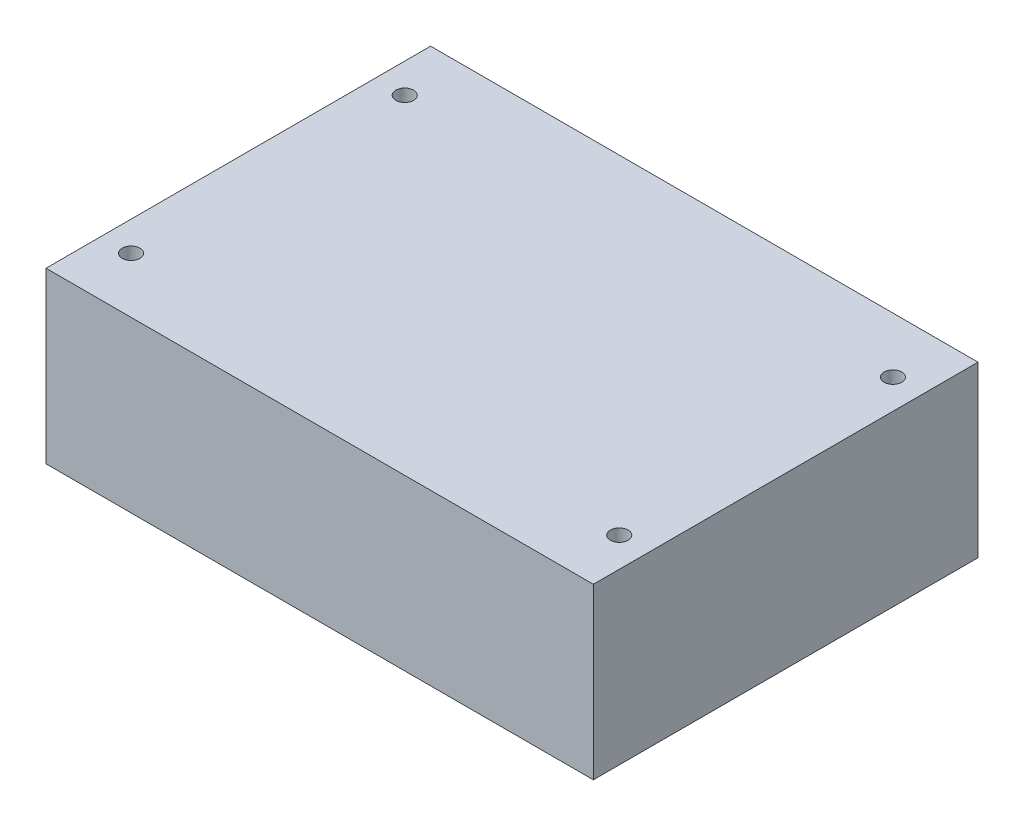
ISO-10303-21;
HEADER;
FILE_DESCRIPTION(('STEP AP214'),'2;1');
FILE_NAME('part.step','',(''),(''),'','','');
FILE_SCHEMA(('AUTOMOTIVE_DESIGN { 1 0 10303 214 1 1 1 1 }'));
ENDSEC;
DATA;
#1=APPLICATION_CONTEXT('core data for automotive mechanical design processes');
#2=APPLICATION_PROTOCOL_DEFINITION('international standard','automotive_design',2000,#1);
#3=PRODUCT_CONTEXT('',#1,'mechanical');
#4=PRODUCT('Part','Part','',(#3));
#5=PRODUCT_RELATED_PRODUCT_CATEGORY('part','',(#4));
#6=PRODUCT_DEFINITION_FORMATION('','',#4);
#7=PRODUCT_DEFINITION_CONTEXT('part definition',#1,'design');
#8=PRODUCT_DEFINITION('design','',#6,#7);
#9=PRODUCT_DEFINITION_SHAPE('','',#8);
#10=(LENGTH_UNIT() NAMED_UNIT(*) SI_UNIT(.MILLI.,.METRE.));
#11=(NAMED_UNIT(*) PLANE_ANGLE_UNIT() SI_UNIT($,.RADIAN.));
#12=(NAMED_UNIT(*) SI_UNIT($,.STERADIAN.) SOLID_ANGLE_UNIT());
#13=UNCERTAINTY_MEASURE_WITH_UNIT(LENGTH_MEASURE(1.E-05),#10,'distance_accuracy_value','');
#14=(GEOMETRIC_REPRESENTATION_CONTEXT(3) GLOBAL_UNCERTAINTY_ASSIGNED_CONTEXT((#13)) GLOBAL_UNIT_ASSIGNED_CONTEXT((#10,
#11,#12)) REPRESENTATION_CONTEXT('',''));
#15=CARTESIAN_POINT('',(0.,0.,0.));
#16=DIRECTION('',(0.,0.,1.));
#17=DIRECTION('',(1.,0.,0.));
#18=AXIS2_PLACEMENT_3D('',#15,#16,#17);
#19=CARTESIAN_POINT('',(63.98994351206,33.9,-99.5340959573736));
#20=DIRECTION('',(0.,0.,-1.));
#21=DIRECTION('',(-1.,0.,0.));
#22=AXIS2_PLACEMENT_3D('',#19,#20,#21);
#23=PLANE('',#22);
#24=DIRECTION('',(1.,0.,0.));
#25=VECTOR('',#24,1.);
#26=CARTESIAN_POINT('',(63.98994351206,11.,-99.5340959573736));
#27=LINE('',#26,#25);
#28=CARTESIAN_POINT('',(63.98994351206,11.,-99.5340959573736));
#29=VERTEX_POINT('',#28);
#30=CARTESIAN_POINT('',(137.98994351206,11.,-99.5340959573736));
#31=VERTEX_POINT('',#30);
#32=EDGE_CURVE('E122',#29,#31,#27,.T.);
#33=ORIENTED_EDGE('',*,*,#32,.F.);
#34=DIRECTION('',(0.,-1.,0.));
#35=VECTOR('',#34,1.);
#36=CARTESIAN_POINT('',(63.98994351206,33.9,-99.5340959573736));
#37=LINE('',#36,#35);
#38=CARTESIAN_POINT('',(63.98994351206,33.9,-99.5340959573736));
#39=VERTEX_POINT('',#38);
#40=EDGE_CURVE('E11',#39,#29,#37,.T.);
#41=ORIENTED_EDGE('',*,*,#40,.F.);
#42=DIRECTION('',(1.,0.,0.));
#43=VECTOR('',#42,1.);
#44=CARTESIAN_POINT('',(63.98994351206,33.9,-99.5340959573736));
#45=LINE('',#44,#43);
#46=CARTESIAN_POINT('',(137.98994351206,33.9,-99.5340959573736));
#47=VERTEX_POINT('',#46);
#48=EDGE_CURVE('E123',#39,#47,#45,.T.);
#49=ORIENTED_EDGE('',*,*,#48,.T.);
#50=DIRECTION('',(0.,-1.,0.));
#51=VECTOR('',#50,1.);
#52=CARTESIAN_POINT('',(137.98994351206,33.9,-99.5340959573736));
#53=LINE('',#52,#51);
#54=EDGE_CURVE('E35',#47,#31,#53,.T.);
#55=ORIENTED_EDGE('',*,*,#54,.T.);
#56=EDGE_LOOP('',(#33,#41,#49,#55));
#57=FACE_BOUND('',#56,.T.);
#58=ADVANCED_FACE('F32',(#57),#23,.T.);
#59=CARTESIAN_POINT('',(63.98994351206,33.9,-47.5340959573736));
#60=DIRECTION('',(-1.,0.,0.));
#61=DIRECTION('',(0.,0.,1.));
#62=AXIS2_PLACEMENT_3D('',#59,#60,#61);
#63=PLANE('',#62);
#64=DIRECTION('',(0.,0.,-1.));
#65=VECTOR('',#64,1.);
#66=CARTESIAN_POINT('',(63.98994351206,11.,-47.5340959573736));
#67=LINE('',#66,#65);
#68=CARTESIAN_POINT('',(63.98994351206,11.,-47.5340959573736));
#69=VERTEX_POINT('',#68);
#70=EDGE_CURVE('E125',#69,#29,#67,.T.);
#71=ORIENTED_EDGE('',*,*,#70,.F.);
#72=DIRECTION('',(0.,-1.,0.));
#73=VECTOR('',#72,1.);
#74=CARTESIAN_POINT('',(63.98994351206,33.9,-47.5340959573736));
#75=LINE('',#74,#73);
#76=CARTESIAN_POINT('',(63.98994351206,33.9,-47.5340959573736));
#77=VERTEX_POINT('',#76);
#78=EDGE_CURVE('E41',#77,#69,#75,.T.);
#79=ORIENTED_EDGE('',*,*,#78,.F.);
#80=DIRECTION('',(0.,0.,-1.));
#81=VECTOR('',#80,1.);
#82=CARTESIAN_POINT('',(63.98994351206,33.9,-47.5340959573736));
#83=LINE('',#82,#81);
#84=EDGE_CURVE('E129',#77,#39,#83,.T.);
#85=ORIENTED_EDGE('',*,*,#84,.T.);
#86=ORIENTED_EDGE('',*,*,#40,.T.);
#87=EDGE_LOOP('',(#71,#79,#85,#86));
#88=FACE_BOUND('',#87,.T.);
#89=ADVANCED_FACE('F148',(#88),#63,.T.);
#90=CARTESIAN_POINT('',(63.98994351206,33.9,-47.5340959573736));
#91=DIRECTION('',(0.,0.,-1.));
#92=DIRECTION('',(-1.,0.,0.));
#93=AXIS2_PLACEMENT_3D('',#90,#91,#92);
#94=PLANE('',#93);
#95=DIRECTION('',(1.,0.,0.));
#96=VECTOR('',#95,1.);
#97=CARTESIAN_POINT('',(63.98994351206,11.,-47.5340959573736));
#98=LINE('',#97,#96);
#99=CARTESIAN_POINT('',(137.98994351206,11.,-47.5340959573736));
#100=VERTEX_POINT('',#99);
#101=EDGE_CURVE('E136',#69,#100,#98,.T.);
#102=ORIENTED_EDGE('',*,*,#101,.T.);
#103=DIRECTION('',(0.,-1.,0.));
#104=VECTOR('',#103,1.);
#105=CARTESIAN_POINT('',(137.98994351206,33.9,-47.5340959573736));
#106=LINE('',#105,#104);
#107=CARTESIAN_POINT('',(137.98994351206,33.9,-47.5340959573736));
#108=VERTEX_POINT('',#107);
#109=EDGE_CURVE('E140',#108,#100,#106,.T.);
#110=ORIENTED_EDGE('',*,*,#109,.F.);
#111=DIRECTION('',(1.,0.,0.));
#112=VECTOR('',#111,1.);
#113=CARTESIAN_POINT('',(63.98994351206,33.9,-47.5340959573736));
#114=LINE('',#113,#112);
#115=EDGE_CURVE('E127',#77,#108,#114,.T.);
#116=ORIENTED_EDGE('',*,*,#115,.F.);
#117=ORIENTED_EDGE('',*,*,#78,.T.);
#118=EDGE_LOOP('',(#102,#110,#116,#117));
#119=FACE_BOUND('',#118,.T.);
#120=ADVANCED_FACE('F150',(#119),#94,.F.);
#121=CARTESIAN_POINT('',(137.98994351206,33.9,-47.5340959573736));
#122=DIRECTION('',(-1.,0.,0.));
#123=DIRECTION('',(0.,0.,1.));
#124=AXIS2_PLACEMENT_3D('',#121,#122,#123);
#125=PLANE('',#124);
#126=DIRECTION('',(0.,0.,-1.));
#127=VECTOR('',#126,1.);
#128=CARTESIAN_POINT('',(137.98994351206,11.,-47.5340959573736));
#129=LINE('',#128,#127);
#130=EDGE_CURVE('E133',#100,#31,#129,.T.);
#131=ORIENTED_EDGE('',*,*,#130,.T.);
#132=ORIENTED_EDGE('',*,*,#54,.F.);
#133=DIRECTION('',(0.,0.,-1.));
#134=VECTOR('',#133,1.);
#135=CARTESIAN_POINT('',(137.98994351206,33.9,-47.5340959573736));
#136=LINE('',#135,#134);
#137=EDGE_CURVE('E75',#108,#47,#136,.T.);
#138=ORIENTED_EDGE('',*,*,#137,.F.);
#139=ORIENTED_EDGE('',*,*,#109,.T.);
#140=EDGE_LOOP('',(#131,#132,#138,#139));
#141=FACE_BOUND('',#140,.T.);
#142=ADVANCED_FACE('F145',(#141),#125,.F.);
#143=CARTESIAN_POINT('',(0.,33.9,0.));
#144=DIRECTION('',(0.,1.,0.));
#145=DIRECTION('',(0.,0.,1.));
#146=AXIS2_PLACEMENT_3D('',#143,#144,#145);
#147=PLANE('',#146);
#148=CARTESIAN_POINT('',(67.98994351206,33.9,-92.0340959573736));
#149=DIRECTION('',(0.,1.,0.));
#150=DIRECTION('',(0.,0.,1.));
#151=AXIS2_PLACEMENT_3D('',#148,#149,#150);
#152=CIRCLE('',#151,1.20000000000001);
#153=CARTESIAN_POINT('',(67.98994351206,33.9,-90.8340959573736));
#154=VERTEX_POINT('',#153);
#155=EDGE_CURVE('E100',#154,#154,#152,.T.);
#156=ORIENTED_EDGE('',*,*,#155,.F.);
#157=EDGE_LOOP('',(#156));
#158=FACE_BOUND('',#157,.T.);
#159=CARTESIAN_POINT('',(133.98994351206,33.9,-92.0340959573736));
#160=DIRECTION('',(0.,1.,0.));
#161=DIRECTION('',(0.,0.,1.));
#162=AXIS2_PLACEMENT_3D('',#159,#160,#161);
#163=CIRCLE('',#162,1.20000000000001);
#164=CARTESIAN_POINT('',(133.98994351206,33.9,-90.8340959573736));
#165=VERTEX_POINT('',#164);
#166=EDGE_CURVE('E99',#165,#165,#163,.T.);
#167=ORIENTED_EDGE('',*,*,#166,.F.);
#168=EDGE_LOOP('',(#167));
#169=FACE_BOUND('',#168,.T.);
#170=CARTESIAN_POINT('',(133.98994351206,33.9,-55.0340959573736));
#171=DIRECTION('',(0.,1.,0.));
#172=DIRECTION('',(0.,0.,1.));
#173=AXIS2_PLACEMENT_3D('',#170,#171,#172);
#174=CIRCLE('',#173,1.20000000000001);
#175=CARTESIAN_POINT('',(133.98994351206,33.9,-53.8340959573736));
#176=VERTEX_POINT('',#175);
#177=EDGE_CURVE('E110',#176,#176,#174,.T.);
#178=ORIENTED_EDGE('',*,*,#177,.F.);
#179=EDGE_LOOP('',(#178));
#180=FACE_BOUND('',#179,.T.);
#181=CARTESIAN_POINT('',(67.98994351206,33.9,-55.0340959573736));
#182=DIRECTION('',(0.,1.,0.));
#183=DIRECTION('',(0.,0.,1.));
#184=AXIS2_PLACEMENT_3D('',#181,#182,#183);
#185=CIRCLE('',#184,1.20000000000001);
#186=CARTESIAN_POINT('',(67.98994351206,33.9,-53.8340959573736));
#187=VERTEX_POINT('',#186);
#188=EDGE_CURVE('E116',#187,#187,#185,.T.);
#189=ORIENTED_EDGE('',*,*,#188,.F.);
#190=EDGE_LOOP('',(#189));
#191=FACE_BOUND('',#190,.T.);
#192=ORIENTED_EDGE('',*,*,#48,.F.);
#193=ORIENTED_EDGE('',*,*,#84,.F.);
#194=ORIENTED_EDGE('',*,*,#115,.T.);
#195=ORIENTED_EDGE('',*,*,#137,.T.);
#196=EDGE_LOOP('',(#192,#193,#194,#195));
#197=FACE_BOUND('',#196,.T.);
#198=ADVANCED_FACE('F151',(#158,#169,#180,#191,#197),#147,.T.);
#199=CARTESIAN_POINT('',(0.,11.,0.));
#200=DIRECTION('',(0.,1.,0.));
#201=DIRECTION('',(0.,0.,1.));
#202=AXIS2_PLACEMENT_3D('',#199,#200,#201);
#203=PLANE('',#202);
#204=ORIENTED_EDGE('',*,*,#32,.T.);
#205=ORIENTED_EDGE('',*,*,#130,.F.);
#206=ORIENTED_EDGE('',*,*,#101,.F.);
#207=ORIENTED_EDGE('',*,*,#70,.T.);
#208=EDGE_LOOP('',(#204,#205,#206,#207));
#209=FACE_BOUND('',#208,.T.);
#210=ADVANCED_FACE('F147',(#209),#203,.F.);
#211=CARTESIAN_POINT('',(67.98994351206,31.4,-55.0340959573736));
#212=DIRECTION('',(0.,1.,0.));
#213=DIRECTION('',(0.,0.,1.));
#214=AXIS2_PLACEMENT_3D('',#211,#212,#213);
#215=CONICAL_SURFACE('',#214,1.19999999999999,1.02974425867665);
#216=CARTESIAN_POINT('',(67.98994351206,30.6789672571669,-55.0340959573736));
#217=VERTEX_POINT('',#216);
#218=VERTEX_LOOP('',#217);
#219=FACE_BOUND('',#218,.T.);
#220=CARTESIAN_POINT('',(67.98994351206,31.4,-55.0340959573736));
#221=DIRECTION('',(0.,1.,0.));
#222=DIRECTION('',(0.,0.,1.));
#223=AXIS2_PLACEMENT_3D('',#220,#221,#222);
#224=CIRCLE('',#223,1.19999999999999);
#225=CARTESIAN_POINT('',(67.98994351206,31.4,-53.8340959573736));
#226=VERTEX_POINT('',#225);
#227=EDGE_CURVE('E119',#226,#226,#224,.T.);
#228=ORIENTED_EDGE('',*,*,#227,.T.);
#229=EDGE_LOOP('',(#228));
#230=FACE_BOUND('',#229,.T.);
#231=ADVANCED_FACE('F159',(#219,#230),#215,.F.);
#232=CARTESIAN_POINT('',(67.98994351206,33.9,-55.0340959573736));
#233=DIRECTION('',(0.,1.,0.));
#234=DIRECTION('',(0.,0.,1.));
#235=AXIS2_PLACEMENT_3D('',#232,#233,#234);
#236=CYLINDRICAL_SURFACE('',#235,1.2);
#237=ORIENTED_EDGE('',*,*,#227,.F.);
#238=EDGE_LOOP('',(#237));
#239=FACE_BOUND('',#238,.T.);
#240=ORIENTED_EDGE('',*,*,#188,.T.);
#241=EDGE_LOOP('',(#240));
#242=FACE_BOUND('',#241,.T.);
#243=ADVANCED_FACE('F198',(#239,#242),#236,.F.);
#244=CARTESIAN_POINT('',(133.98994351206,31.4,-55.0340959573736));
#245=DIRECTION('',(0.,1.,0.));
#246=DIRECTION('',(0.,0.,1.));
#247=AXIS2_PLACEMENT_3D('',#244,#245,#246);
#248=CONICAL_SURFACE('',#247,1.20000000000001,1.02974425867666);
#249=CARTESIAN_POINT('',(133.98994351206,30.6789672571669,-55.0340959573736));
#250=VERTEX_POINT('',#249);
#251=VERTEX_LOOP('',#250);
#252=FACE_BOUND('',#251,.T.);
#253=CARTESIAN_POINT('',(133.98994351206,31.4,-55.0340959573736));
#254=DIRECTION('',(0.,1.,0.));
#255=DIRECTION('',(0.,0.,1.));
#256=AXIS2_PLACEMENT_3D('',#253,#254,#255);
#257=CIRCLE('',#256,1.20000000000001);
#258=CARTESIAN_POINT('',(133.98994351206,31.4,-53.8340959573736));
#259=VERTEX_POINT('',#258);
#260=EDGE_CURVE('E113',#259,#259,#257,.T.);
#261=ORIENTED_EDGE('',*,*,#260,.T.);
#262=EDGE_LOOP('',(#261));
#263=FACE_BOUND('',#262,.T.);
#264=ADVANCED_FACE('F207',(#252,#263),#248,.F.);
#265=CARTESIAN_POINT('',(133.98994351206,33.9,-55.0340959573736));
#266=DIRECTION('',(0.,1.,0.));
#267=DIRECTION('',(0.,0.,1.));
#268=AXIS2_PLACEMENT_3D('',#265,#266,#267);
#269=CYLINDRICAL_SURFACE('',#268,1.20000000000001);
#270=ORIENTED_EDGE('',*,*,#260,.F.);
#271=EDGE_LOOP('',(#270));
#272=FACE_BOUND('',#271,.T.);
#273=ORIENTED_EDGE('',*,*,#177,.T.);
#274=EDGE_LOOP('',(#273));
#275=FACE_BOUND('',#274,.T.);
#276=ADVANCED_FACE('F217',(#272,#275),#269,.F.);
#277=CARTESIAN_POINT('',(133.98994351206,31.4,-92.0340959573736));
#278=DIRECTION('',(0.,1.,0.));
#279=DIRECTION('',(0.,0.,1.));
#280=AXIS2_PLACEMENT_3D('',#277,#278,#279);
#281=CONICAL_SURFACE('',#280,1.20000000000001,1.02974425867666);
#282=CARTESIAN_POINT('',(133.98994351206,30.6789672571669,-92.0340959573736));
#283=VERTEX_POINT('',#282);
#284=VERTEX_LOOP('',#283);
#285=FACE_BOUND('',#284,.T.);
#286=CARTESIAN_POINT('',(133.98994351206,31.4,-92.0340959573736));
#287=DIRECTION('',(0.,1.,0.));
#288=DIRECTION('',(0.,0.,1.));
#289=AXIS2_PLACEMENT_3D('',#286,#287,#288);
#290=CIRCLE('',#289,1.20000000000001);
#291=CARTESIAN_POINT('',(133.98994351206,31.4,-90.8340959573736));
#292=VERTEX_POINT('',#291);
#293=EDGE_CURVE('E103',#292,#292,#290,.T.);
#294=ORIENTED_EDGE('',*,*,#293,.T.);
#295=EDGE_LOOP('',(#294));
#296=FACE_BOUND('',#295,.T.);
#297=ADVANCED_FACE('F227',(#285,#296),#281,.F.);
#298=CARTESIAN_POINT('',(133.98994351206,33.9,-92.0340959573736));
#299=DIRECTION('',(0.,1.,0.));
#300=DIRECTION('',(0.,0.,1.));
#301=AXIS2_PLACEMENT_3D('',#298,#299,#300);
#302=CYLINDRICAL_SURFACE('',#301,1.20000000000001);
#303=ORIENTED_EDGE('',*,*,#293,.F.);
#304=EDGE_LOOP('',(#303));
#305=FACE_BOUND('',#304,.T.);
#306=ORIENTED_EDGE('',*,*,#166,.T.);
#307=EDGE_LOOP('',(#306));
#308=FACE_BOUND('',#307,.T.);
#309=ADVANCED_FACE('F93',(#305,#308),#302,.F.);
#310=CARTESIAN_POINT('',(67.98994351206,31.4,-92.0340959573736));
#311=DIRECTION('',(0.,1.,0.));
#312=DIRECTION('',(0.,0.,1.));
#313=AXIS2_PLACEMENT_3D('',#310,#311,#312);
#314=CONICAL_SURFACE('',#313,1.19999999999999,1.02974425867665);
#315=CARTESIAN_POINT('',(67.98994351206,30.6789672571669,-92.0340959573736));
#316=VERTEX_POINT('',#315);
#317=VERTEX_LOOP('',#316);
#318=FACE_BOUND('',#317,.T.);
#319=CARTESIAN_POINT('',(67.98994351206,31.4,-92.0340959573736));
#320=DIRECTION('',(0.,1.,0.));
#321=DIRECTION('',(0.,0.,1.));
#322=AXIS2_PLACEMENT_3D('',#319,#320,#321);
#323=CIRCLE('',#322,1.19999999999999);
#324=CARTESIAN_POINT('',(67.98994351206,31.4,-90.8340959573736));
#325=VERTEX_POINT('',#324);
#326=EDGE_CURVE('E97',#325,#325,#323,.T.);
#327=ORIENTED_EDGE('',*,*,#326,.T.);
#328=EDGE_LOOP('',(#327));
#329=FACE_BOUND('',#328,.T.);
#330=ADVANCED_FACE('F89',(#318,#329),#314,.F.);
#331=CARTESIAN_POINT('',(67.98994351206,33.9,-92.0340959573736));
#332=DIRECTION('',(0.,1.,0.));
#333=DIRECTION('',(0.,0.,1.));
#334=AXIS2_PLACEMENT_3D('',#331,#332,#333);
#335=CYLINDRICAL_SURFACE('',#334,1.2);
#336=ORIENTED_EDGE('',*,*,#326,.F.);
#337=EDGE_LOOP('',(#336));
#338=FACE_BOUND('',#337,.T.);
#339=ORIENTED_EDGE('',*,*,#155,.T.);
#340=EDGE_LOOP('',(#339));
#341=FACE_BOUND('',#340,.T.);
#342=ADVANCED_FACE('F92',(#338,#341),#335,.F.);
#343=CLOSED_SHELL('',(#58,#89,#120,#142,#198,#210,#231,#243,#264,#276,#297,#309,#330,#342));
#344=MANIFOLD_SOLID_BREP('B2',#343);
#345=ADVANCED_BREP_SHAPE_REPRESENTATION('',(#18,#344),#14);
#346=SHAPE_DEFINITION_REPRESENTATION(#9,#345);
ENDSEC;
END-ISO-10303-21;
